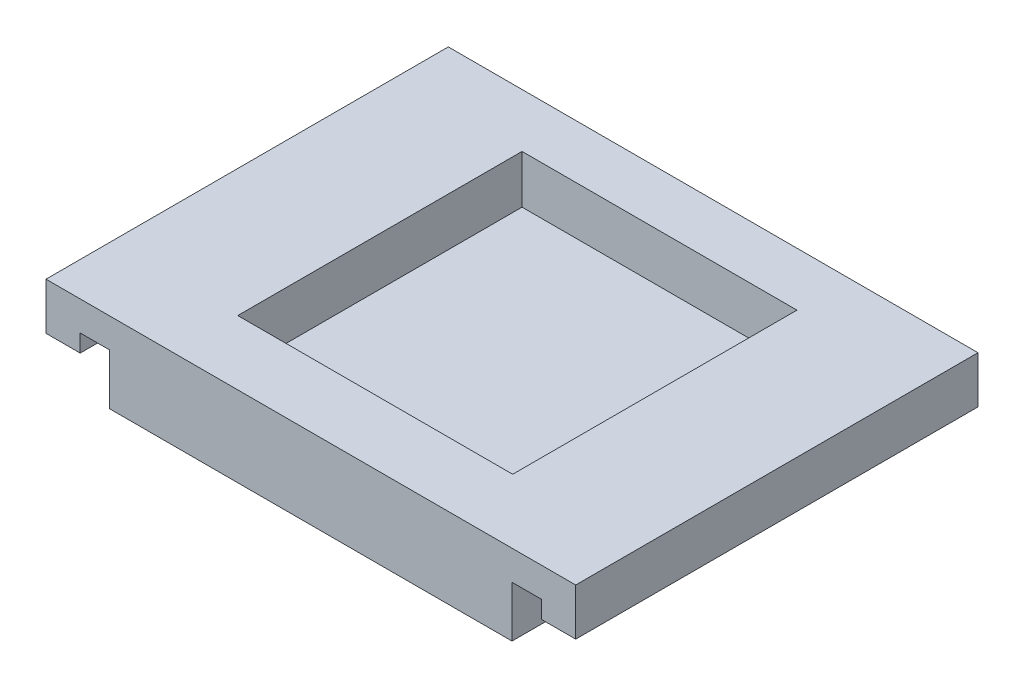
ISO-10303-21;
HEADER;
FILE_DESCRIPTION(('STEP AP214'),'2;1');
FILE_NAME('part.step','',(''),(''),'','','');
FILE_SCHEMA(('AUTOMOTIVE_DESIGN { 1 0 10303 214 1 1 1 1 }'));
ENDSEC;
DATA;
#1=APPLICATION_CONTEXT('core data for automotive mechanical design processes');
#2=APPLICATION_PROTOCOL_DEFINITION('international standard','automotive_design',2000,#1);
#3=PRODUCT_CONTEXT('',#1,'mechanical');
#4=PRODUCT('Part','Part','',(#3));
#5=PRODUCT_RELATED_PRODUCT_CATEGORY('part','',(#4));
#6=PRODUCT_DEFINITION_FORMATION('','',#4);
#7=PRODUCT_DEFINITION_CONTEXT('part definition',#1,'design');
#8=PRODUCT_DEFINITION('design','',#6,#7);
#9=PRODUCT_DEFINITION_SHAPE('','',#8);
#10=(LENGTH_UNIT() NAMED_UNIT(*) SI_UNIT(.MILLI.,.METRE.));
#11=(NAMED_UNIT(*) PLANE_ANGLE_UNIT() SI_UNIT($,.RADIAN.));
#12=(NAMED_UNIT(*) SI_UNIT($,.STERADIAN.) SOLID_ANGLE_UNIT());
#13=UNCERTAINTY_MEASURE_WITH_UNIT(LENGTH_MEASURE(1.E-05),#10,'distance_accuracy_value','');
#14=(GEOMETRIC_REPRESENTATION_CONTEXT(3) GLOBAL_UNCERTAINTY_ASSIGNED_CONTEXT((#13)) GLOBAL_UNIT_ASSIGNED_CONTEXT((#10,
#11,#12)) REPRESENTATION_CONTEXT('',''));
#15=CARTESIAN_POINT('',(0.,0.,0.));
#16=DIRECTION('',(0.,0.,1.));
#17=DIRECTION('',(1.,0.,0.));
#18=AXIS2_PLACEMENT_3D('',#15,#16,#17);
#19=CARTESIAN_POINT('',(15.,11.,15.));
#20=DIRECTION('',(-1.,0.,0.));
#21=DIRECTION('',(0.,0.,1.));
#22=AXIS2_PLACEMENT_3D('',#19,#20,#21);
#23=PLANE('',#22);
#24=DIRECTION('',(0.,0.,-1.));
#25=VECTOR('',#24,1.);
#26=CARTESIAN_POINT('',(15.,3.8,15.));
#27=LINE('',#26,#25);
#28=CARTESIAN_POINT('',(15.,3.8,15.));
#29=VERTEX_POINT('',#28);
#30=CARTESIAN_POINT('',(15.,3.8,-15.));
#31=VERTEX_POINT('',#30);
#32=EDGE_CURVE('E213',#29,#31,#27,.T.);
#33=ORIENTED_EDGE('',*,*,#32,.F.);
#34=DIRECTION('',(0.,-1.,0.));
#35=VECTOR('',#34,1.);
#36=CARTESIAN_POINT('',(15.,11.,15.));
#37=LINE('',#36,#35);
#38=CARTESIAN_POINT('',(15.,0.,15.));
#39=VERTEX_POINT('',#38);
#40=EDGE_CURVE('E289',#29,#39,#37,.T.);
#41=ORIENTED_EDGE('',*,*,#40,.T.);
#42=DIRECTION('',(0.,0.,-1.));
#43=VECTOR('',#42,1.);
#44=CARTESIAN_POINT('',(15.,0.,15.));
#45=LINE('',#44,#43);
#46=CARTESIAN_POINT('',(15.,0.,-15.));
#47=VERTEX_POINT('',#46);
#48=EDGE_CURVE('E277',#39,#47,#45,.T.);
#49=ORIENTED_EDGE('',*,*,#48,.T.);
#50=DIRECTION('',(0.,-1.,0.));
#51=VECTOR('',#50,1.);
#52=CARTESIAN_POINT('',(15.,11.,-15.));
#53=LINE('',#52,#51);
#54=EDGE_CURVE('E295',#31,#47,#53,.T.);
#55=ORIENTED_EDGE('',*,*,#54,.F.);
#56=EDGE_LOOP('',(#33,#41,#49,#55));
#57=FACE_BOUND('',#56,.T.);
#58=ADVANCED_FACE('F39',(#57),#23,.F.);
#59=CARTESIAN_POINT('',(-8.92,6.,10.));
#60=DIRECTION('',(0.,0.,-1.));
#61=DIRECTION('',(-1.,0.,0.));
#62=AXIS2_PLACEMENT_3D('',#59,#60,#61);
#63=PLANE('',#62);
#64=DIRECTION('',(0.,-1.,0.));
#65=VECTOR('',#64,1.);
#66=CARTESIAN_POINT('',(-8.92,6.,10.));
#67=LINE('',#66,#65);
#68=CARTESIAN_POINT('',(-8.92,2.4,10.));
#69=VERTEX_POINT('',#68);
#70=CARTESIAN_POINT('',(-8.92,0.,10.));
#71=VERTEX_POINT('',#70);
#72=EDGE_CURVE('E269',#69,#71,#67,.T.);
#73=ORIENTED_EDGE('',*,*,#72,.F.);
#74=DIRECTION('',(1.,0.,0.));
#75=VECTOR('',#74,1.);
#76=CARTESIAN_POINT('',(-8.92,2.4,10.));
#77=LINE('',#76,#75);
#78=CARTESIAN_POINT('',(8.92,2.4,10.));
#79=VERTEX_POINT('',#78);
#80=EDGE_CURVE('E254',#69,#79,#77,.T.);
#81=ORIENTED_EDGE('',*,*,#80,.T.);
#82=DIRECTION('',(0.,-1.,0.));
#83=VECTOR('',#82,1.);
#84=CARTESIAN_POINT('',(8.92,6.,10.));
#85=LINE('',#84,#83);
#86=CARTESIAN_POINT('',(8.92,0.,10.));
#87=VERTEX_POINT('',#86);
#88=EDGE_CURVE('E275',#79,#87,#85,.T.);
#89=ORIENTED_EDGE('',*,*,#88,.T.);
#90=DIRECTION('',(1.,0.,0.));
#91=VECTOR('',#90,1.);
#92=CARTESIAN_POINT('',(-8.92,0.,10.));
#93=LINE('',#92,#91);
#94=EDGE_CURVE('E257',#71,#87,#93,.T.);
#95=ORIENTED_EDGE('',*,*,#94,.F.);
#96=EDGE_LOOP('',(#73,#81,#89,#95));
#97=FACE_BOUND('',#96,.T.);
#98=ADVANCED_FACE('F306',(#97),#63,.T.);
#99=CARTESIAN_POINT('',(8.92,6.,7.2));
#100=DIRECTION('',(1.,0.,0.));
#101=DIRECTION('',(0.,0.,-1.));
#102=AXIS2_PLACEMENT_3D('',#99,#100,#101);
#103=PLANE('',#102);
#104=DIRECTION('',(0.,0.,1.));
#105=VECTOR('',#104,1.);
#106=CARTESIAN_POINT('',(8.92,2.4,7.2));
#107=LINE('',#106,#105);
#108=CARTESIAN_POINT('',(8.92,2.4,7.2));
#109=VERTEX_POINT('',#108);
#110=EDGE_CURVE('E252',#109,#79,#107,.T.);
#111=ORIENTED_EDGE('',*,*,#110,.F.);
#112=DIRECTION('',(0.,-1.,0.));
#113=VECTOR('',#112,1.);
#114=CARTESIAN_POINT('',(8.92,6.,7.2));
#115=LINE('',#114,#113);
#116=CARTESIAN_POINT('',(8.92,0.,7.2));
#117=VERTEX_POINT('',#116);
#118=EDGE_CURVE('E273',#109,#117,#115,.T.);
#119=ORIENTED_EDGE('',*,*,#118,.T.);
#120=DIRECTION('',(0.,0.,1.));
#121=VECTOR('',#120,1.);
#122=CARTESIAN_POINT('',(8.92,0.,7.2));
#123=LINE('',#122,#121);
#124=EDGE_CURVE('E260',#117,#87,#123,.T.);
#125=ORIENTED_EDGE('',*,*,#124,.T.);
#126=ORIENTED_EDGE('',*,*,#88,.F.);
#127=EDGE_LOOP('',(#111,#119,#125,#126));
#128=FACE_BOUND('',#127,.T.);
#129=ADVANCED_FACE('F319',(#128),#103,.F.);
#130=CARTESIAN_POINT('',(-8.92,6.,7.2));
#131=DIRECTION('',(0.,0.,-1.));
#132=DIRECTION('',(-1.,0.,0.));
#133=AXIS2_PLACEMENT_3D('',#130,#131,#132);
#134=PLANE('',#133);
#135=DIRECTION('',(1.,0.,0.));
#136=VECTOR('',#135,1.);
#137=CARTESIAN_POINT('',(-8.92,2.4,7.2));
#138=LINE('',#137,#136);
#139=CARTESIAN_POINT('',(-8.92,2.4,7.2));
#140=VERTEX_POINT('',#139);
#141=EDGE_CURVE('E250',#140,#109,#138,.T.);
#142=ORIENTED_EDGE('',*,*,#141,.F.);
#143=DIRECTION('',(0.,-1.,0.));
#144=VECTOR('',#143,1.);
#145=CARTESIAN_POINT('',(-8.92,6.,7.2));
#146=LINE('',#145,#144);
#147=CARTESIAN_POINT('',(-8.92,0.,7.2));
#148=VERTEX_POINT('',#147);
#149=EDGE_CURVE('E271',#140,#148,#146,.T.);
#150=ORIENTED_EDGE('',*,*,#149,.T.);
#151=DIRECTION('',(1.,0.,0.));
#152=VECTOR('',#151,1.);
#153=CARTESIAN_POINT('',(-8.92,0.,7.2));
#154=LINE('',#153,#152);
#155=EDGE_CURVE('E263',#148,#117,#154,.T.);
#156=ORIENTED_EDGE('',*,*,#155,.T.);
#157=ORIENTED_EDGE('',*,*,#118,.F.);
#158=EDGE_LOOP('',(#142,#150,#156,#157));
#159=FACE_BOUND('',#158,.T.);
#160=ADVANCED_FACE('F314',(#159),#134,.F.);
#161=CARTESIAN_POINT('',(-8.92,6.,7.2));
#162=DIRECTION('',(1.,0.,0.));
#163=DIRECTION('',(0.,0.,-1.));
#164=AXIS2_PLACEMENT_3D('',#161,#162,#163);
#165=PLANE('',#164);
#166=ORIENTED_EDGE('',*,*,#149,.F.);
#167=DIRECTION('',(0.,0.,1.));
#168=VECTOR('',#167,1.);
#169=CARTESIAN_POINT('',(-8.92,2.4,7.2));
#170=LINE('',#169,#168);
#171=EDGE_CURVE('E46',#140,#69,#170,.T.);
#172=ORIENTED_EDGE('',*,*,#171,.T.);
#173=ORIENTED_EDGE('',*,*,#72,.T.);
#174=DIRECTION('',(0.,0.,1.));
#175=VECTOR('',#174,1.);
#176=CARTESIAN_POINT('',(-8.92,0.,7.2));
#177=LINE('',#176,#175);
#178=EDGE_CURVE('E266',#148,#71,#177,.T.);
#179=ORIENTED_EDGE('',*,*,#178,.F.);
#180=EDGE_LOOP('',(#166,#172,#173,#179));
#181=FACE_BOUND('',#180,.T.);
#182=ADVANCED_FACE('F300',(#181),#165,.T.);
#183=CARTESIAN_POINT('',(0.,0.,0.));
#184=DIRECTION('',(0.,-1.,0.));
#185=DIRECTION('',(0.,0.,-1.));
#186=AXIS2_PLACEMENT_3D('',#183,#184,#185);
#187=PLANE('',#186);
#188=ORIENTED_EDGE('',*,*,#48,.F.);
#189=DIRECTION('',(1.,0.,0.));
#190=VECTOR('',#189,1.);
#191=CARTESIAN_POINT('',(-15.,0.,15.));
#192=LINE('',#191,#190);
#193=CARTESIAN_POINT('',(-15.,0.,15.));
#194=VERTEX_POINT('',#193);
#195=EDGE_CURVE('E286',#194,#39,#192,.T.);
#196=ORIENTED_EDGE('',*,*,#195,.F.);
#197=DIRECTION('',(0.,0.,1.));
#198=VECTOR('',#197,1.);
#199=CARTESIAN_POINT('',(-15.,0.,15.));
#200=LINE('',#199,#198);
#201=CARTESIAN_POINT('',(-15.,0.,-15.));
#202=VERTEX_POINT('',#201);
#203=EDGE_CURVE('E283',#202,#194,#200,.T.);
#204=ORIENTED_EDGE('',*,*,#203,.F.);
#205=DIRECTION('',(-1.,0.,0.));
#206=VECTOR('',#205,1.);
#207=CARTESIAN_POINT('',(-15.,0.,-15.));
#208=LINE('',#207,#206);
#209=EDGE_CURVE('E280',#47,#202,#208,.T.);
#210=ORIENTED_EDGE('',*,*,#209,.F.);
#211=EDGE_LOOP('',(#188,#196,#204,#210));
#212=FACE_BOUND('',#211,.T.);
#213=ORIENTED_EDGE('',*,*,#178,.T.);
#214=ORIENTED_EDGE('',*,*,#94,.T.);
#215=ORIENTED_EDGE('',*,*,#124,.F.);
#216=ORIENTED_EDGE('',*,*,#155,.F.);
#217=EDGE_LOOP('',(#213,#214,#215,#216));
#218=FACE_BOUND('',#217,.T.);
#219=ADVANCED_FACE('F311',(#212,#218),#187,.T.);
#220=CARTESIAN_POINT('',(-15.,11.,-15.));
#221=DIRECTION('',(0.,0.,1.));
#222=DIRECTION('',(1.,0.,0.));
#223=AXIS2_PLACEMENT_3D('',#220,#221,#222);
#224=PLANE('',#223);
#225=DIRECTION('',(0.,-1.,0.));
#226=VECTOR('',#225,1.);
#227=CARTESIAN_POINT('',(-19.75,8.5,-15.));
#228=LINE('',#227,#226);
#229=CARTESIAN_POINT('',(-19.75,6.,-15.));
#230=VERTEX_POINT('',#229);
#231=CARTESIAN_POINT('',(-19.75,2.5,-15.));
#232=VERTEX_POINT('',#231);
#233=EDGE_CURVE('E189',#230,#232,#228,.T.);
#234=ORIENTED_EDGE('',*,*,#233,.F.);
#235=DIRECTION('',(-1.,0.,0.));
#236=VECTOR('',#235,1.);
#237=CARTESIAN_POINT('',(24.53538746801,6.,-15.));
#238=LINE('',#237,#236);
#239=CARTESIAN_POINT('',(19.75,6.,-15.));
#240=VERTEX_POINT('',#239);
#241=EDGE_CURVE('E53',#240,#230,#238,.T.);
#242=ORIENTED_EDGE('',*,*,#241,.F.);
#243=DIRECTION('',(0.,-1.,0.));
#244=VECTOR('',#243,1.);
#245=CARTESIAN_POINT('',(19.75,8.5,-15.));
#246=LINE('',#245,#244);
#247=CARTESIAN_POINT('',(19.75,2.5,-15.));
#248=VERTEX_POINT('',#247);
#249=EDGE_CURVE('E186',#240,#248,#246,.T.);
#250=ORIENTED_EDGE('',*,*,#249,.T.);
#251=DIRECTION('',(-1.,0.,0.));
#252=VECTOR('',#251,1.);
#253=CARTESIAN_POINT('',(17.2,2.5,-15.));
#254=LINE('',#253,#252);
#255=CARTESIAN_POINT('',(17.2,2.5,-15.));
#256=VERTEX_POINT('',#255);
#257=EDGE_CURVE('E195',#248,#256,#254,.T.);
#258=ORIENTED_EDGE('',*,*,#257,.T.);
#259=DIRECTION('',(0.,1.,0.));
#260=VECTOR('',#259,1.);
#261=CARTESIAN_POINT('',(17.2,3.8,-15.));
#262=LINE('',#261,#260);
#263=CARTESIAN_POINT('',(17.2,3.8,-15.));
#264=VERTEX_POINT('',#263);
#265=EDGE_CURVE('E198',#256,#264,#262,.T.);
#266=ORIENTED_EDGE('',*,*,#265,.T.);
#267=DIRECTION('',(-1.,0.,0.));
#268=VECTOR('',#267,1.);
#269=CARTESIAN_POINT('',(15.,3.8,-15.));
#270=LINE('',#269,#268);
#271=EDGE_CURVE('E209',#264,#31,#270,.T.);
#272=ORIENTED_EDGE('',*,*,#271,.T.);
#273=ORIENTED_EDGE('',*,*,#54,.T.);
#274=ORIENTED_EDGE('',*,*,#209,.T.);
#275=DIRECTION('',(0.,-1.,0.));
#276=VECTOR('',#275,1.);
#277=CARTESIAN_POINT('',(-15.,11.,-15.));
#278=LINE('',#277,#276);
#279=CARTESIAN_POINT('',(-15.,3.8,-15.));
#280=VERTEX_POINT('',#279);
#281=EDGE_CURVE('E293',#280,#202,#278,.T.);
#282=ORIENTED_EDGE('',*,*,#281,.F.);
#283=DIRECTION('',(1.,0.,0.));
#284=VECTOR('',#283,1.);
#285=CARTESIAN_POINT('',(-15.,3.8,-15.));
#286=LINE('',#285,#284);
#287=CARTESIAN_POINT('',(-17.2,3.8,-15.));
#288=VERTEX_POINT('',#287);
#289=EDGE_CURVE('E60',#288,#280,#286,.T.);
#290=ORIENTED_EDGE('',*,*,#289,.F.);
#291=DIRECTION('',(0.,1.,0.));
#292=VECTOR('',#291,1.);
#293=CARTESIAN_POINT('',(-17.2,3.8,-15.));
#294=LINE('',#293,#292);
#295=CARTESIAN_POINT('',(-17.2,2.5,-15.));
#296=VERTEX_POINT('',#295);
#297=EDGE_CURVE('E373',#296,#288,#294,.T.);
#298=ORIENTED_EDGE('',*,*,#297,.F.);
#299=DIRECTION('',(1.,0.,0.));
#300=VECTOR('',#299,1.);
#301=CARTESIAN_POINT('',(-17.2,2.5,-15.));
#302=LINE('',#301,#300);
#303=EDGE_CURVE('E371',#232,#296,#302,.T.);
#304=ORIENTED_EDGE('',*,*,#303,.F.);
#305=EDGE_LOOP('',(#234,#242,#250,#258,#266,#272,#273,#274,#282,#290,#298,#304));
#306=FACE_BOUND('',#305,.T.);
#307=ADVANCED_FACE('F184',(#306),#224,.F.);
#308=CARTESIAN_POINT('',(-15.,11.,15.));
#309=DIRECTION('',(1.,0.,0.));
#310=DIRECTION('',(0.,0.,-1.));
#311=AXIS2_PLACEMENT_3D('',#308,#309,#310);
#312=PLANE('',#311);
#313=DIRECTION('',(0.,-1.,0.));
#314=VECTOR('',#313,1.);
#315=CARTESIAN_POINT('',(-15.,11.,15.));
#316=LINE('',#315,#314);
#317=CARTESIAN_POINT('',(-15.,3.8,15.));
#318=VERTEX_POINT('',#317);
#319=EDGE_CURVE('E291',#318,#194,#316,.T.);
#320=ORIENTED_EDGE('',*,*,#319,.F.);
#321=DIRECTION('',(0.,0.,-1.));
#322=VECTOR('',#321,1.);
#323=CARTESIAN_POINT('',(-15.,3.8,15.));
#324=LINE('',#323,#322);
#325=EDGE_CURVE('E362',#318,#280,#324,.T.);
#326=ORIENTED_EDGE('',*,*,#325,.T.);
#327=ORIENTED_EDGE('',*,*,#281,.T.);
#328=ORIENTED_EDGE('',*,*,#203,.T.);
#329=EDGE_LOOP('',(#320,#326,#327,#328));
#330=FACE_BOUND('',#329,.T.);
#331=ADVANCED_FACE('F398',(#330),#312,.F.);
#332=CARTESIAN_POINT('',(-15.,11.,15.));
#333=DIRECTION('',(0.,0.,-1.));
#334=DIRECTION('',(-1.,0.,0.));
#335=AXIS2_PLACEMENT_3D('',#332,#333,#334);
#336=PLANE('',#335);
#337=DIRECTION('',(0.,-1.,0.));
#338=VECTOR('',#337,1.);
#339=CARTESIAN_POINT('',(19.75,8.5,15.));
#340=LINE('',#339,#338);
#341=CARTESIAN_POINT('',(19.75,6.,15.));
#342=VERTEX_POINT('',#341);
#343=CARTESIAN_POINT('',(19.75,2.5,15.));
#344=VERTEX_POINT('',#343);
#345=EDGE_CURVE('E212',#342,#344,#340,.T.);
#346=ORIENTED_EDGE('',*,*,#345,.F.);
#347=DIRECTION('',(-1.,0.,0.));
#348=VECTOR('',#347,1.);
#349=CARTESIAN_POINT('',(-15.,6.,15.));
#350=LINE('',#349,#348);
#351=CARTESIAN_POINT('',(-19.75,6.,15.));
#352=VERTEX_POINT('',#351);
#353=EDGE_CURVE('E177',#342,#352,#350,.T.);
#354=ORIENTED_EDGE('',*,*,#353,.T.);
#355=DIRECTION('',(0.,-1.,0.));
#356=VECTOR('',#355,1.);
#357=CARTESIAN_POINT('',(-19.75,8.5,15.));
#358=LINE('',#357,#356);
#359=CARTESIAN_POINT('',(-19.75,2.5,15.));
#360=VERTEX_POINT('',#359);
#361=EDGE_CURVE('E365',#352,#360,#358,.T.);
#362=ORIENTED_EDGE('',*,*,#361,.T.);
#363=DIRECTION('',(1.,0.,0.));
#364=VECTOR('',#363,1.);
#365=CARTESIAN_POINT('',(-17.2,2.5,15.));
#366=LINE('',#365,#364);
#367=CARTESIAN_POINT('',(-17.2,2.5,15.));
#368=VERTEX_POINT('',#367);
#369=EDGE_CURVE('E377',#360,#368,#366,.T.);
#370=ORIENTED_EDGE('',*,*,#369,.T.);
#371=DIRECTION('',(0.,1.,0.));
#372=VECTOR('',#371,1.);
#373=CARTESIAN_POINT('',(-17.2,3.8,15.));
#374=LINE('',#373,#372);
#375=CARTESIAN_POINT('',(-17.2,3.8,15.));
#376=VERTEX_POINT('',#375);
#377=EDGE_CURVE('E379',#368,#376,#374,.T.);
#378=ORIENTED_EDGE('',*,*,#377,.T.);
#379=DIRECTION('',(1.,0.,0.));
#380=VECTOR('',#379,1.);
#381=CARTESIAN_POINT('',(-15.,3.8,15.));
#382=LINE('',#381,#380);
#383=EDGE_CURVE('E370',#376,#318,#382,.T.);
#384=ORIENTED_EDGE('',*,*,#383,.T.);
#385=ORIENTED_EDGE('',*,*,#319,.T.);
#386=ORIENTED_EDGE('',*,*,#195,.T.);
#387=ORIENTED_EDGE('',*,*,#40,.F.);
#388=DIRECTION('',(-1.,0.,0.));
#389=VECTOR('',#388,1.);
#390=CARTESIAN_POINT('',(15.,3.8,15.));
#391=LINE('',#390,#389);
#392=CARTESIAN_POINT('',(17.2,3.8,15.));
#393=VERTEX_POINT('',#392);
#394=EDGE_CURVE('E204',#393,#29,#391,.T.);
#395=ORIENTED_EDGE('',*,*,#394,.F.);
#396=DIRECTION('',(0.,1.,0.));
#397=VECTOR('',#396,1.);
#398=CARTESIAN_POINT('',(17.2,3.8,15.));
#399=LINE('',#398,#397);
#400=CARTESIAN_POINT('',(17.2,2.5,15.));
#401=VERTEX_POINT('',#400);
#402=EDGE_CURVE('E355',#401,#393,#399,.T.);
#403=ORIENTED_EDGE('',*,*,#402,.F.);
#404=DIRECTION('',(-1.,0.,0.));
#405=VECTOR('',#404,1.);
#406=CARTESIAN_POINT('',(17.2,2.5,15.));
#407=LINE('',#406,#405);
#408=EDGE_CURVE('E358',#344,#401,#407,.T.);
#409=ORIENTED_EDGE('',*,*,#408,.F.);
#410=EDGE_LOOP('',(#346,#354,#362,#370,#378,#384,#385,#386,#387,#395,#403,#409));
#411=FACE_BOUND('',#410,.T.);
#412=ADVANCED_FACE('F341',(#411),#336,.F.);
#413=CARTESIAN_POINT('',(10.25,2.4,10.2));
#414=DIRECTION('',(-1.,0.,0.));
#415=DIRECTION('',(0.,-1.,0.));
#416=AXIS2_PLACEMENT_3D('',#413,#414,#415);
#417=PLANE('',#416);
#418=DIRECTION('',(0.,0.,-1.));
#419=VECTOR('',#418,1.);
#420=CARTESIAN_POINT('',(10.25,2.4,10.2));
#421=LINE('',#420,#419);
#422=CARTESIAN_POINT('',(10.25,2.4,10.2));
#423=VERTEX_POINT('',#422);
#424=CARTESIAN_POINT('',(10.25,2.4,-11.));
#425=VERTEX_POINT('',#424);
#426=EDGE_CURVE('E241',#423,#425,#421,.T.);
#427=ORIENTED_EDGE('',*,*,#426,.F.);
#428=DIRECTION('',(0.,1.,0.));
#429=VECTOR('',#428,1.);
#430=CARTESIAN_POINT('',(10.25,2.4,10.2));
#431=LINE('',#430,#429);
#432=CARTESIAN_POINT('',(10.25,6.,10.2));
#433=VERTEX_POINT('',#432);
#434=EDGE_CURVE('E232',#423,#433,#431,.T.);
#435=ORIENTED_EDGE('',*,*,#434,.T.);
#436=DIRECTION('',(0.,0.,-1.));
#437=VECTOR('',#436,1.);
#438=CARTESIAN_POINT('',(10.25,6.,10.2));
#439=LINE('',#438,#437);
#440=CARTESIAN_POINT('',(10.25,6.,-11.));
#441=VERTEX_POINT('',#440);
#442=EDGE_CURVE('E247',#433,#441,#439,.T.);
#443=ORIENTED_EDGE('',*,*,#442,.T.);
#444=DIRECTION('',(0.,1.,0.));
#445=VECTOR('',#444,1.);
#446=CARTESIAN_POINT('',(10.25,2.4,-11.));
#447=LINE('',#446,#445);
#448=EDGE_CURVE('E226',#425,#441,#447,.T.);
#449=ORIENTED_EDGE('',*,*,#448,.F.);
#450=EDGE_LOOP('',(#427,#435,#443,#449));
#451=FACE_BOUND('',#450,.T.);
#452=ADVANCED_FACE('F406',(#451),#417,.T.);
#453=CARTESIAN_POINT('',(-10.25,2.4,10.2));
#454=DIRECTION('',(1.,0.,0.));
#455=DIRECTION('',(0.,1.,0.));
#456=AXIS2_PLACEMENT_3D('',#453,#454,#455);
#457=PLANE('',#456);
#458=DIRECTION('',(0.,0.,-1.));
#459=VECTOR('',#458,1.);
#460=CARTESIAN_POINT('',(-10.25,6.,10.2));
#461=LINE('',#460,#459);
#462=CARTESIAN_POINT('',(-10.25,6.,10.2));
#463=VERTEX_POINT('',#462);
#464=CARTESIAN_POINT('',(-10.25,6.,-11.));
#465=VERTEX_POINT('',#464);
#466=EDGE_CURVE('E245',#463,#465,#461,.T.);
#467=ORIENTED_EDGE('',*,*,#466,.F.);
#468=DIRECTION('',(0.,-1.,0.));
#469=VECTOR('',#468,1.);
#470=CARTESIAN_POINT('',(-10.25,2.4,10.2));
#471=LINE('',#470,#469);
#472=CARTESIAN_POINT('',(-10.25,2.4,10.2));
#473=VERTEX_POINT('',#472);
#474=EDGE_CURVE('E237',#463,#473,#471,.T.);
#475=ORIENTED_EDGE('',*,*,#474,.T.);
#476=DIRECTION('',(0.,0.,-1.));
#477=VECTOR('',#476,1.);
#478=CARTESIAN_POINT('',(-10.25,2.4,10.2));
#479=LINE('',#478,#477);
#480=CARTESIAN_POINT('',(-10.25,2.4,-11.));
#481=VERTEX_POINT('',#480);
#482=EDGE_CURVE('E243',#473,#481,#479,.T.);
#483=ORIENTED_EDGE('',*,*,#482,.T.);
#484=DIRECTION('',(0.,-1.,0.));
#485=VECTOR('',#484,1.);
#486=CARTESIAN_POINT('',(-10.25,2.4,-11.));
#487=LINE('',#486,#485);
#488=EDGE_CURVE('E215',#465,#481,#487,.T.);
#489=ORIENTED_EDGE('',*,*,#488,.F.);
#490=EDGE_LOOP('',(#467,#475,#483,#489));
#491=FACE_BOUND('',#490,.T.);
#492=ADVANCED_FACE('F420',(#491),#457,.T.);
#493=CARTESIAN_POINT('',(-10.25,2.4,10.2));
#494=DIRECTION('',(0.,1.,0.));
#495=DIRECTION('',(0.,0.,1.));
#496=AXIS2_PLACEMENT_3D('',#493,#494,#495);
#497=PLANE('',#496);
#498=ORIENTED_EDGE('',*,*,#171,.F.);
#499=ORIENTED_EDGE('',*,*,#141,.T.);
#500=ORIENTED_EDGE('',*,*,#110,.T.);
#501=ORIENTED_EDGE('',*,*,#80,.F.);
#502=EDGE_LOOP('',(#498,#499,#500,#501));
#503=FACE_BOUND('',#502,.T.);
#504=ORIENTED_EDGE('',*,*,#482,.F.);
#505=DIRECTION('',(1.,0.,0.));
#506=VECTOR('',#505,1.);
#507=CARTESIAN_POINT('',(-10.25,2.4,10.2));
#508=LINE('',#507,#506);
#509=EDGE_CURVE('E239',#473,#423,#508,.T.);
#510=ORIENTED_EDGE('',*,*,#509,.T.);
#511=ORIENTED_EDGE('',*,*,#426,.T.);
#512=DIRECTION('',(1.,0.,0.));
#513=VECTOR('',#512,1.);
#514=CARTESIAN_POINT('',(-10.25,2.4,-11.));
#515=LINE('',#514,#513);
#516=EDGE_CURVE('E223',#481,#425,#515,.T.);
#517=ORIENTED_EDGE('',*,*,#516,.F.);
#518=EDGE_LOOP('',(#504,#510,#511,#517));
#519=FACE_BOUND('',#518,.T.);
#520=ADVANCED_FACE('F316',(#503,#519),#497,.T.);
#521=CARTESIAN_POINT('',(0.,0.,10.2));
#522=DIRECTION('',(0.,0.,-1.));
#523=DIRECTION('',(-1.,0.,0.));
#524=AXIS2_PLACEMENT_3D('',#521,#522,#523);
#525=PLANE('',#524);
#526=ORIENTED_EDGE('',*,*,#434,.F.);
#527=ORIENTED_EDGE('',*,*,#509,.F.);
#528=ORIENTED_EDGE('',*,*,#474,.F.);
#529=DIRECTION('',(-1.,0.,0.));
#530=VECTOR('',#529,1.);
#531=CARTESIAN_POINT('',(-10.25,6.,10.2));
#532=LINE('',#531,#530);
#533=EDGE_CURVE('E235',#433,#463,#532,.T.);
#534=ORIENTED_EDGE('',*,*,#533,.F.);
#535=EDGE_LOOP('',(#526,#527,#528,#534));
#536=FACE_BOUND('',#535,.T.);
#537=ADVANCED_FACE('F426',(#536),#525,.T.);
#538=CARTESIAN_POINT('',(0.,0.,-11.));
#539=DIRECTION('',(0.,0.,-1.));
#540=DIRECTION('',(-1.,0.,0.));
#541=AXIS2_PLACEMENT_3D('',#538,#539,#540);
#542=PLANE('',#541);
#543=ORIENTED_EDGE('',*,*,#488,.T.);
#544=ORIENTED_EDGE('',*,*,#516,.T.);
#545=ORIENTED_EDGE('',*,*,#448,.T.);
#546=DIRECTION('',(-1.,0.,0.));
#547=VECTOR('',#546,1.);
#548=CARTESIAN_POINT('',(-10.25,6.,-11.));
#549=LINE('',#548,#547);
#550=EDGE_CURVE('E229',#441,#465,#549,.T.);
#551=ORIENTED_EDGE('',*,*,#550,.T.);
#552=EDGE_LOOP('',(#543,#544,#545,#551));
#553=FACE_BOUND('',#552,.T.);
#554=ADVANCED_FACE('F429',(#553),#542,.F.);
#555=CARTESIAN_POINT('',(15.,3.8,15.));
#556=DIRECTION('',(0.,-1.,0.));
#557=DIRECTION('',(1.,0.,0.));
#558=AXIS2_PLACEMENT_3D('',#555,#556,#557);
#559=PLANE('',#558);
#560=ORIENTED_EDGE('',*,*,#271,.F.);
#561=DIRECTION('',(0.,0.,-1.));
#562=VECTOR('',#561,1.);
#563=CARTESIAN_POINT('',(17.2,3.8,15.));
#564=LINE('',#563,#562);
#565=EDGE_CURVE('E216',#393,#264,#564,.T.);
#566=ORIENTED_EDGE('',*,*,#565,.F.);
#567=ORIENTED_EDGE('',*,*,#394,.T.);
#568=ORIENTED_EDGE('',*,*,#32,.T.);
#569=EDGE_LOOP('',(#560,#566,#567,#568));
#570=FACE_BOUND('',#569,.T.);
#571=ADVANCED_FACE('F352',(#570),#559,.T.);
#572=CARTESIAN_POINT('',(17.2,3.8,15.));
#573=DIRECTION('',(-1.,0.,0.));
#574=DIRECTION('',(0.,0.,1.));
#575=AXIS2_PLACEMENT_3D('',#572,#573,#574);
#576=PLANE('',#575);
#577=ORIENTED_EDGE('',*,*,#265,.F.);
#578=DIRECTION('',(0.,0.,-1.));
#579=VECTOR('',#578,1.);
#580=CARTESIAN_POINT('',(17.2,2.5,15.));
#581=LINE('',#580,#579);
#582=EDGE_CURVE('E218',#401,#256,#581,.T.);
#583=ORIENTED_EDGE('',*,*,#582,.F.);
#584=ORIENTED_EDGE('',*,*,#402,.T.);
#585=ORIENTED_EDGE('',*,*,#565,.T.);
#586=EDGE_LOOP('',(#577,#583,#584,#585));
#587=FACE_BOUND('',#586,.T.);
#588=ADVANCED_FACE('F354',(#587),#576,.T.);
#589=CARTESIAN_POINT('',(17.2,2.5,15.));
#590=DIRECTION('',(0.,-1.,0.));
#591=DIRECTION('',(0.,0.,-1.));
#592=AXIS2_PLACEMENT_3D('',#589,#590,#591);
#593=PLANE('',#592);
#594=ORIENTED_EDGE('',*,*,#257,.F.);
#595=DIRECTION('',(0.,0.,-1.));
#596=VECTOR('',#595,1.);
#597=CARTESIAN_POINT('',(19.75,2.5,15.));
#598=LINE('',#597,#596);
#599=EDGE_CURVE('E193',#344,#248,#598,.T.);
#600=ORIENTED_EDGE('',*,*,#599,.F.);
#601=ORIENTED_EDGE('',*,*,#408,.T.);
#602=ORIENTED_EDGE('',*,*,#582,.T.);
#603=EDGE_LOOP('',(#594,#600,#601,#602));
#604=FACE_BOUND('',#603,.T.);
#605=ADVANCED_FACE('F436',(#604),#593,.T.);
#606=CARTESIAN_POINT('',(19.75,8.5,15.));
#607=DIRECTION('',(1.,0.,0.));
#608=DIRECTION('',(0.,0.,-1.));
#609=AXIS2_PLACEMENT_3D('',#606,#607,#608);
#610=PLANE('',#609);
#611=DIRECTION('',(0.,0.,-1.));
#612=VECTOR('',#611,1.);
#613=CARTESIAN_POINT('',(19.75,6.,15.));
#614=LINE('',#613,#612);
#615=EDGE_CURVE('E174',#342,#240,#614,.T.);
#616=ORIENTED_EDGE('',*,*,#615,.F.);
#617=ORIENTED_EDGE('',*,*,#345,.T.);
#618=ORIENTED_EDGE('',*,*,#599,.T.);
#619=ORIENTED_EDGE('',*,*,#249,.F.);
#620=EDGE_LOOP('',(#616,#617,#618,#619));
#621=FACE_BOUND('',#620,.T.);
#622=ADVANCED_FACE('F191',(#621),#610,.T.);
#623=CARTESIAN_POINT('',(-19.75,8.5,15.));
#624=DIRECTION('',(1.,0.,0.));
#625=DIRECTION('',(0.,0.,-1.));
#626=AXIS2_PLACEMENT_3D('',#623,#624,#625);
#627=PLANE('',#626);
#628=ORIENTED_EDGE('',*,*,#361,.F.);
#629=DIRECTION('',(0.,0.,-1.));
#630=VECTOR('',#629,1.);
#631=CARTESIAN_POINT('',(-19.75,6.,15.));
#632=LINE('',#631,#630);
#633=EDGE_CURVE('E11',#352,#230,#632,.T.);
#634=ORIENTED_EDGE('',*,*,#633,.T.);
#635=ORIENTED_EDGE('',*,*,#233,.T.);
#636=DIRECTION('',(0.,0.,-1.));
#637=VECTOR('',#636,1.);
#638=CARTESIAN_POINT('',(-19.75,2.5,15.));
#639=LINE('',#638,#637);
#640=EDGE_CURVE('E196',#360,#232,#639,.T.);
#641=ORIENTED_EDGE('',*,*,#640,.F.);
#642=EDGE_LOOP('',(#628,#634,#635,#641));
#643=FACE_BOUND('',#642,.T.);
#644=ADVANCED_FACE('F385',(#643),#627,.F.);
#645=CARTESIAN_POINT('',(-17.2,2.5,15.));
#646=DIRECTION('',(0.,1.,0.));
#647=DIRECTION('',(0.,0.,1.));
#648=AXIS2_PLACEMENT_3D('',#645,#646,#647);
#649=PLANE('',#648);
#650=ORIENTED_EDGE('',*,*,#303,.T.);
#651=DIRECTION('',(0.,0.,-1.));
#652=VECTOR('',#651,1.);
#653=CARTESIAN_POINT('',(-17.2,2.5,15.));
#654=LINE('',#653,#652);
#655=EDGE_CURVE('E201',#368,#296,#654,.T.);
#656=ORIENTED_EDGE('',*,*,#655,.F.);
#657=ORIENTED_EDGE('',*,*,#369,.F.);
#658=ORIENTED_EDGE('',*,*,#640,.T.);
#659=EDGE_LOOP('',(#650,#656,#657,#658));
#660=FACE_BOUND('',#659,.T.);
#661=ADVANCED_FACE('F389',(#660),#649,.F.);
#662=CARTESIAN_POINT('',(-17.2,3.8,15.));
#663=DIRECTION('',(-1.,0.,0.));
#664=DIRECTION('',(0.,0.,1.));
#665=AXIS2_PLACEMENT_3D('',#662,#663,#664);
#666=PLANE('',#665);
#667=ORIENTED_EDGE('',*,*,#297,.T.);
#668=DIRECTION('',(0.,0.,-1.));
#669=VECTOR('',#668,1.);
#670=CARTESIAN_POINT('',(-17.2,3.8,15.));
#671=LINE('',#670,#669);
#672=EDGE_CURVE('E364',#376,#288,#671,.T.);
#673=ORIENTED_EDGE('',*,*,#672,.F.);
#674=ORIENTED_EDGE('',*,*,#377,.F.);
#675=ORIENTED_EDGE('',*,*,#655,.T.);
#676=EDGE_LOOP('',(#667,#673,#674,#675));
#677=FACE_BOUND('',#676,.T.);
#678=ADVANCED_FACE('F394',(#677),#666,.F.);
#679=CARTESIAN_POINT('',(-15.,3.8,15.));
#680=DIRECTION('',(0.,1.,0.));
#681=DIRECTION('',(-1.,0.,0.));
#682=AXIS2_PLACEMENT_3D('',#679,#680,#681);
#683=PLANE('',#682);
#684=ORIENTED_EDGE('',*,*,#289,.T.);
#685=ORIENTED_EDGE('',*,*,#325,.F.);
#686=ORIENTED_EDGE('',*,*,#383,.F.);
#687=ORIENTED_EDGE('',*,*,#672,.T.);
#688=EDGE_LOOP('',(#684,#685,#686,#687));
#689=FACE_BOUND('',#688,.T.);
#690=ADVANCED_FACE('F396',(#689),#683,.F.);
#691=CARTESIAN_POINT('',(24.53538746801,6.,25.));
#692=DIRECTION('',(0.,-1.,0.));
#693=DIRECTION('',(0.,0.,-1.));
#694=AXIS2_PLACEMENT_3D('',#691,#692,#693);
#695=PLANE('',#694);
#696=ORIENTED_EDGE('',*,*,#533,.T.);
#697=ORIENTED_EDGE('',*,*,#466,.T.);
#698=ORIENTED_EDGE('',*,*,#550,.F.);
#699=ORIENTED_EDGE('',*,*,#442,.F.);
#700=EDGE_LOOP('',(#696,#697,#698,#699));
#701=FACE_BOUND('',#700,.T.);
#702=ORIENTED_EDGE('',*,*,#615,.T.);
#703=ORIENTED_EDGE('',*,*,#241,.T.);
#704=ORIENTED_EDGE('',*,*,#633,.F.);
#705=ORIENTED_EDGE('',*,*,#353,.F.);
#706=EDGE_LOOP('',(#702,#703,#704,#705));
#707=FACE_BOUND('',#706,.T.);
#708=ADVANCED_FACE('F175',(#701,#707),#695,.F.);
#709=CLOSED_SHELL('',(#58,#98,#129,#160,#182,#219,#307,#331,#412,#452,#492,#520,#537,#554,#571,
#588,#605,#622,#644,#661,#678,#690,#708));
#710=MANIFOLD_SOLID_BREP('B2',#709);
#711=ADVANCED_BREP_SHAPE_REPRESENTATION('',(#18,#710),#14);
#712=SHAPE_DEFINITION_REPRESENTATION(#9,#711);
ENDSEC;
END-ISO-10303-21;
